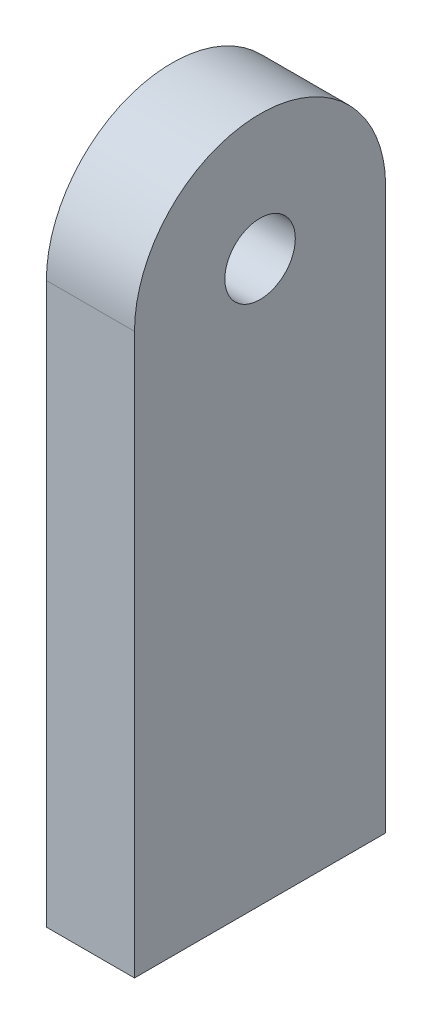
ISO-10303-21;
HEADER;
FILE_DESCRIPTION(('STEP AP214'),'2;1');
FILE_NAME('part.step','',(''),(''),'','','');
FILE_SCHEMA(('AUTOMOTIVE_DESIGN { 1 0 10303 214 1 1 1 1 }'));
ENDSEC;
DATA;
#1=APPLICATION_CONTEXT('core data for automotive mechanical design processes');
#2=APPLICATION_PROTOCOL_DEFINITION('international standard','automotive_design',2000,#1);
#3=PRODUCT_CONTEXT('',#1,'mechanical');
#4=PRODUCT('Part','Part','',(#3));
#5=PRODUCT_RELATED_PRODUCT_CATEGORY('part','',(#4));
#6=PRODUCT_DEFINITION_FORMATION('','',#4);
#7=PRODUCT_DEFINITION_CONTEXT('part definition',#1,'design');
#8=PRODUCT_DEFINITION('design','',#6,#7);
#9=PRODUCT_DEFINITION_SHAPE('','',#8);
#10=(LENGTH_UNIT() NAMED_UNIT(*) SI_UNIT(.MILLI.,.METRE.));
#11=(NAMED_UNIT(*) PLANE_ANGLE_UNIT() SI_UNIT($,.RADIAN.));
#12=(NAMED_UNIT(*) SI_UNIT($,.STERADIAN.) SOLID_ANGLE_UNIT());
#13=UNCERTAINTY_MEASURE_WITH_UNIT(LENGTH_MEASURE(1.E-05),#10,'distance_accuracy_value','');
#14=(GEOMETRIC_REPRESENTATION_CONTEXT(3) GLOBAL_UNCERTAINTY_ASSIGNED_CONTEXT((#13)) GLOBAL_UNIT_ASSIGNED_CONTEXT((#10,
#11,#12)) REPRESENTATION_CONTEXT('',''));
#15=CARTESIAN_POINT('',(0.,0.,0.));
#16=DIRECTION('',(0.,0.,1.));
#17=DIRECTION('',(1.,0.,0.));
#18=AXIS2_PLACEMENT_3D('',#15,#16,#17);
#19=CARTESIAN_POINT('',(10.,-15.1860092615053,-35.7506070078134));
#20=DIRECTION('',(-1.,0.,0.));
#21=DIRECTION('',(0.,0.,1.));
#22=AXIS2_PLACEMENT_3D('',#19,#20,#21);
#23=PLANE('',#22);
#24=CARTESIAN_POINT('',(10.,-15.1860092615053,-35.7506070078134));
#25=DIRECTION('',(1.,0.,0.));
#26=DIRECTION('',(0.,0.,1.));
#27=AXIS2_PLACEMENT_3D('',#24,#25,#26);
#28=CIRCLE('',#27,14.2506070078134);
#29=CARTESIAN_POINT('',(10.,-15.,-50.));
#30=VERTEX_POINT('',#29);
#31=CARTESIAN_POINT('',(10.,-15.1860092615053,-21.5));
#32=VERTEX_POINT('',#31);
#33=EDGE_CURVE('E83',#30,#32,#28,.T.);
#34=ORIENTED_EDGE('',*,*,#33,.T.);
#35=DIRECTION('',(0.,-1.,0.));
#36=VECTOR('',#35,1.);
#37=CARTESIAN_POINT('',(10.,-15.1860092615053,-21.5));
#38=LINE('',#37,#36);
#39=CARTESIAN_POINT('',(10.,-78.7374472946283,-21.5));
#40=VERTEX_POINT('',#39);
#41=EDGE_CURVE('E78',#32,#40,#38,.T.);
#42=ORIENTED_EDGE('',*,*,#41,.T.);
#43=DIRECTION('',(0.,0.,-1.));
#44=VECTOR('',#43,1.);
#45=CARTESIAN_POINT('',(10.,-78.7374472946283,-21.5));
#46=LINE('',#45,#44);
#47=CARTESIAN_POINT('',(10.,-78.7374472946283,-50.));
#48=VERTEX_POINT('',#47);
#49=EDGE_CURVE('E81',#40,#48,#46,.T.);
#50=ORIENTED_EDGE('',*,*,#49,.T.);
#51=DIRECTION('',(0.,1.,0.));
#52=VECTOR('',#51,1.);
#53=CARTESIAN_POINT('',(10.,-15.,-50.));
#54=LINE('',#53,#52);
#55=EDGE_CURVE('E48',#48,#30,#54,.T.);
#56=ORIENTED_EDGE('',*,*,#55,.T.);
#57=EDGE_LOOP('',(#34,#42,#50,#56));
#58=FACE_BOUND('',#57,.T.);
#59=CARTESIAN_POINT('',(10.,-15.1860092615053,-35.75));
#60=DIRECTION('',(1.,0.,0.));
#61=DIRECTION('',(0.,0.,-1.));
#62=AXIS2_PLACEMENT_3D('',#59,#60,#61);
#63=CIRCLE('',#62,4.00000000000451);
#64=CARTESIAN_POINT('',(10.,-15.1860092615053,-39.7500000000045));
#65=VERTEX_POINT('',#64);
#66=EDGE_CURVE('E98',#65,#65,#63,.T.);
#67=ORIENTED_EDGE('',*,*,#66,.F.);
#68=EDGE_LOOP('',(#67));
#69=FACE_BOUND('',#68,.T.);
#70=ADVANCED_FACE('F31',(#58,#69),#23,.F.);
#71=CARTESIAN_POINT('',(0.,-15.1860092615053,-35.7506070078134));
#72=DIRECTION('',(-1.,0.,0.));
#73=DIRECTION('',(0.,0.,1.));
#74=AXIS2_PLACEMENT_3D('',#71,#72,#73);
#75=PLANE('',#74);
#76=CARTESIAN_POINT('',(0.,-15.1860092615053,-35.7506070078134));
#77=DIRECTION('',(1.,0.,0.));
#78=DIRECTION('',(0.,0.,1.));
#79=AXIS2_PLACEMENT_3D('',#76,#77,#78);
#80=CIRCLE('',#79,14.2506070078134);
#81=CARTESIAN_POINT('',(0.,-15.,-50.));
#82=VERTEX_POINT('',#81);
#83=CARTESIAN_POINT('',(0.,-15.1860092615053,-21.5));
#84=VERTEX_POINT('',#83);
#85=EDGE_CURVE('E95',#82,#84,#80,.T.);
#86=ORIENTED_EDGE('',*,*,#85,.F.);
#87=DIRECTION('',(0.,1.,0.));
#88=VECTOR('',#87,1.);
#89=CARTESIAN_POINT('',(0.,-15.,-50.));
#90=LINE('',#89,#88);
#91=CARTESIAN_POINT('',(0.,-78.7374472946283,-50.));
#92=VERTEX_POINT('',#91);
#93=EDGE_CURVE('E71',#92,#82,#90,.T.);
#94=ORIENTED_EDGE('',*,*,#93,.F.);
#95=DIRECTION('',(0.,0.,-1.));
#96=VECTOR('',#95,1.);
#97=CARTESIAN_POINT('',(0.,-78.7374472946283,-21.5));
#98=LINE('',#97,#96);
#99=CARTESIAN_POINT('',(0.,-78.7374472946283,-21.5));
#100=VERTEX_POINT('',#99);
#101=EDGE_CURVE('E65',#100,#92,#98,.T.);
#102=ORIENTED_EDGE('',*,*,#101,.F.);
#103=DIRECTION('',(0.,-1.,0.));
#104=VECTOR('',#103,1.);
#105=CARTESIAN_POINT('',(0.,-15.1860092615053,-21.5));
#106=LINE('',#105,#104);
#107=EDGE_CURVE('E87',#84,#100,#106,.T.);
#108=ORIENTED_EDGE('',*,*,#107,.F.);
#109=EDGE_LOOP('',(#86,#94,#102,#108));
#110=FACE_BOUND('',#109,.T.);
#111=CARTESIAN_POINT('',(0.,-15.1860092615053,-35.75));
#112=DIRECTION('',(1.,0.,0.));
#113=DIRECTION('',(0.,0.,-1.));
#114=AXIS2_PLACEMENT_3D('',#111,#112,#113);
#115=CIRCLE('',#114,4.00000000000451);
#116=CARTESIAN_POINT('',(0.,-15.1860092615053,-39.7500000000045));
#117=VERTEX_POINT('',#116);
#118=EDGE_CURVE('E110',#117,#117,#115,.T.);
#119=ORIENTED_EDGE('',*,*,#118,.T.);
#120=EDGE_LOOP('',(#119));
#121=FACE_BOUND('',#120,.T.);
#122=ADVANCED_FACE('F106',(#110,#121),#75,.T.);
#123=CARTESIAN_POINT('',(10.,-15.1860092615053,-35.7506070078134));
#124=DIRECTION('',(-1.,0.,0.));
#125=DIRECTION('',(0.,0.,1.));
#126=AXIS2_PLACEMENT_3D('',#123,#124,#125);
#127=CYLINDRICAL_SURFACE('',#126,14.2506070078134);
#128=ORIENTED_EDGE('',*,*,#85,.T.);
#129=DIRECTION('',(-1.,0.,0.));
#130=VECTOR('',#129,1.);
#131=CARTESIAN_POINT('',(10.,-15.1860092615053,-21.5));
#132=LINE('',#131,#130);
#133=EDGE_CURVE('E11',#32,#84,#132,.T.);
#134=ORIENTED_EDGE('',*,*,#133,.F.);
#135=ORIENTED_EDGE('',*,*,#33,.F.);
#136=DIRECTION('',(-1.,0.,0.));
#137=VECTOR('',#136,1.);
#138=CARTESIAN_POINT('',(10.,-15.,-50.));
#139=LINE('',#138,#137);
#140=EDGE_CURVE('E91',#30,#82,#139,.T.);
#141=ORIENTED_EDGE('',*,*,#140,.T.);
#142=EDGE_LOOP('',(#128,#134,#135,#141));
#143=FACE_BOUND('',#142,.T.);
#144=ADVANCED_FACE('F33',(#143),#127,.T.);
#145=CARTESIAN_POINT('',(10.,-15.1860092615053,-21.5));
#146=DIRECTION('',(0.,0.,-1.));
#147=DIRECTION('',(0.,1.,0.));
#148=AXIS2_PLACEMENT_3D('',#145,#146,#147);
#149=PLANE('',#148);
#150=ORIENTED_EDGE('',*,*,#107,.T.);
#151=DIRECTION('',(-1.,0.,0.));
#152=VECTOR('',#151,1.);
#153=CARTESIAN_POINT('',(10.,-78.7374472946283,-21.5));
#154=LINE('',#153,#152);
#155=EDGE_CURVE('E40',#40,#100,#154,.T.);
#156=ORIENTED_EDGE('',*,*,#155,.F.);
#157=ORIENTED_EDGE('',*,*,#41,.F.);
#158=ORIENTED_EDGE('',*,*,#133,.T.);
#159=EDGE_LOOP('',(#150,#156,#157,#158));
#160=FACE_BOUND('',#159,.T.);
#161=ADVANCED_FACE('F86',(#160),#149,.F.);
#162=CARTESIAN_POINT('',(10.,-78.7374472946283,-21.5));
#163=DIRECTION('',(0.,1.,0.));
#164=DIRECTION('',(0.,0.,1.));
#165=AXIS2_PLACEMENT_3D('',#162,#163,#164);
#166=PLANE('',#165);
#167=ORIENTED_EDGE('',*,*,#101,.T.);
#168=DIRECTION('',(-1.,0.,0.));
#169=VECTOR('',#168,1.);
#170=CARTESIAN_POINT('',(10.,-78.7374472946283,-50.));
#171=LINE('',#170,#169);
#172=EDGE_CURVE('E88',#48,#92,#171,.T.);
#173=ORIENTED_EDGE('',*,*,#172,.F.);
#174=ORIENTED_EDGE('',*,*,#49,.F.);
#175=ORIENTED_EDGE('',*,*,#155,.T.);
#176=EDGE_LOOP('',(#167,#173,#174,#175));
#177=FACE_BOUND('',#176,.T.);
#178=ADVANCED_FACE('F89',(#177),#166,.F.);
#179=CARTESIAN_POINT('',(10.,-15.,-50.));
#180=DIRECTION('',(0.,0.,1.));
#181=DIRECTION('',(0.,-1.,0.));
#182=AXIS2_PLACEMENT_3D('',#179,#180,#181);
#183=PLANE('',#182);
#184=ORIENTED_EDGE('',*,*,#93,.T.);
#185=ORIENTED_EDGE('',*,*,#140,.F.);
#186=ORIENTED_EDGE('',*,*,#55,.F.);
#187=ORIENTED_EDGE('',*,*,#172,.T.);
#188=EDGE_LOOP('',(#184,#185,#186,#187));
#189=FACE_BOUND('',#188,.T.);
#190=ADVANCED_FACE('F103',(#189),#183,.F.);
#191=CARTESIAN_POINT('',(10.,-15.1860092615053,-35.75));
#192=DIRECTION('',(-1.,0.,0.));
#193=DIRECTION('',(0.,0.,1.));
#194=AXIS2_PLACEMENT_3D('',#191,#192,#193);
#195=CYLINDRICAL_SURFACE('',#194,4.00000000000451);
#196=ORIENTED_EDGE('',*,*,#66,.T.);
#197=EDGE_LOOP('',(#196));
#198=FACE_BOUND('',#197,.T.);
#199=ORIENTED_EDGE('',*,*,#118,.F.);
#200=EDGE_LOOP('',(#199));
#201=FACE_BOUND('',#200,.T.);
#202=ADVANCED_FACE('F116',(#198,#201),#195,.F.);
#203=CLOSED_SHELL('',(#70,#122,#144,#161,#178,#190,#202));
#204=MANIFOLD_SOLID_BREP('B2',#203);
#205=ADVANCED_BREP_SHAPE_REPRESENTATION('',(#18,#204),#14);
#206=SHAPE_DEFINITION_REPRESENTATION(#9,#205);
ENDSEC;
END-ISO-10303-21;
